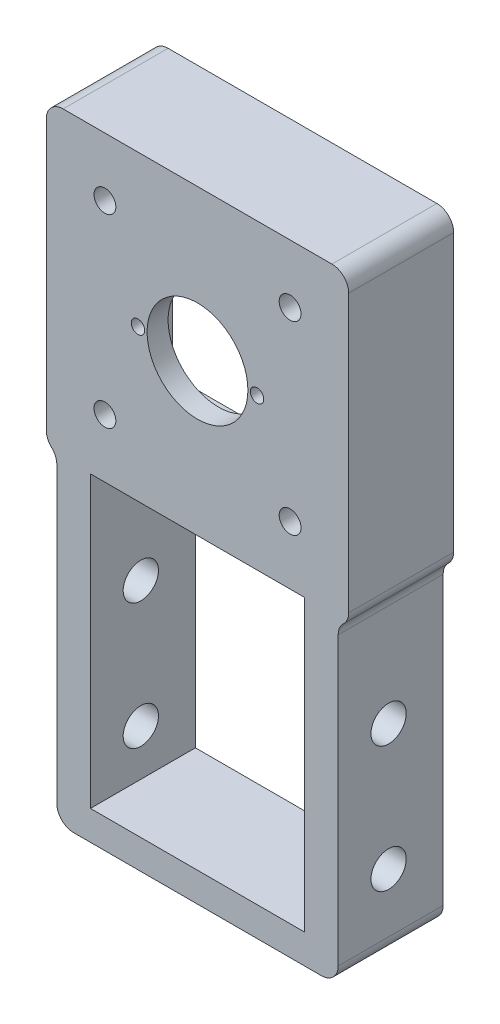
ISO-10303-21;
HEADER;
FILE_DESCRIPTION(('STEP AP214'),'2;1');
FILE_NAME('part.step','',(''),(''),'','','');
FILE_SCHEMA(('AUTOMOTIVE_DESIGN { 1 0 10303 214 1 1 1 1 }'));
ENDSEC;
DATA;
#1=APPLICATION_CONTEXT('core data for automotive mechanical design processes');
#2=APPLICATION_PROTOCOL_DEFINITION('international standard','automotive_design',2000,#1);
#3=PRODUCT_CONTEXT('',#1,'mechanical');
#4=PRODUCT('Part','Part','',(#3));
#5=PRODUCT_RELATED_PRODUCT_CATEGORY('part','',(#4));
#6=PRODUCT_DEFINITION_FORMATION('','',#4);
#7=PRODUCT_DEFINITION_CONTEXT('part definition',#1,'design');
#8=PRODUCT_DEFINITION('design','',#6,#7);
#9=PRODUCT_DEFINITION_SHAPE('','',#8);
#10=(LENGTH_UNIT() NAMED_UNIT(*) SI_UNIT(.MILLI.,.METRE.));
#11=(NAMED_UNIT(*) PLANE_ANGLE_UNIT() SI_UNIT($,.RADIAN.));
#12=(NAMED_UNIT(*) SI_UNIT($,.STERADIAN.) SOLID_ANGLE_UNIT());
#13=UNCERTAINTY_MEASURE_WITH_UNIT(LENGTH_MEASURE(1.E-05),#10,'distance_accuracy_value','');
#14=(GEOMETRIC_REPRESENTATION_CONTEXT(3) GLOBAL_UNCERTAINTY_ASSIGNED_CONTEXT((#13)) GLOBAL_UNIT_ASSIGNED_CONTEXT((#10,
#11,#12)) REPRESENTATION_CONTEXT('',''));
#15=CARTESIAN_POINT('',(0.,0.,0.));
#16=DIRECTION('',(0.,0.,1.));
#17=DIRECTION('',(1.,0.,0.));
#18=AXIS2_PLACEMENT_3D('',#15,#16,#17);
#19=CARTESIAN_POINT('',(3.175,-3.175,3.175));
#20=DIRECTION('',(0.,-1.,0.));
#21=DIRECTION('',(1.,0.,0.));
#22=AXIS2_PLACEMENT_3D('',#19,#20,#21);
#23=PLANE('',#22);
#24=DIRECTION('',(-1.,0.,0.));
#25=VECTOR('',#24,1.);
#26=CARTESIAN_POINT('',(3.175,-3.175,-12.7));
#27=LINE('',#26,#25);
#28=CARTESIAN_POINT('',(-3.4925,-3.175,-12.7));
#29=VERTEX_POINT('',#28);
#30=CARTESIAN_POINT('',(-35.8775,-3.175,-12.7));
#31=VERTEX_POINT('',#30);
#32=EDGE_CURVE('E273',#29,#31,#27,.T.);
#33=ORIENTED_EDGE('',*,*,#32,.F.);
#34=DIRECTION('',(0.,0.,-1.));
#35=VECTOR('',#34,1.);
#36=CARTESIAN_POINT('',(-3.4925,-3.175,3.175));
#37=LINE('',#36,#35);
#38=CARTESIAN_POINT('',(-3.4925,-3.175,3.175));
#39=VERTEX_POINT('',#38);
#40=EDGE_CURVE('E217',#39,#29,#37,.T.);
#41=ORIENTED_EDGE('',*,*,#40,.F.);
#42=DIRECTION('',(-1.,0.,0.));
#43=VECTOR('',#42,1.);
#44=CARTESIAN_POINT('',(3.175,-3.175,3.175));
#45=LINE('',#44,#43);
#46=CARTESIAN_POINT('',(-35.8775,-3.175,3.175));
#47=VERTEX_POINT('',#46);
#48=EDGE_CURVE('E215',#39,#47,#45,.T.);
#49=ORIENTED_EDGE('',*,*,#48,.T.);
#50=DIRECTION('',(0.,0.,-1.));
#51=VECTOR('',#50,1.);
#52=CARTESIAN_POINT('',(-35.8775,-3.175,3.175));
#53=LINE('',#52,#51);
#54=EDGE_CURVE('E222',#47,#31,#53,.T.);
#55=ORIENTED_EDGE('',*,*,#54,.T.);
#56=EDGE_LOOP('',(#33,#41,#49,#55));
#57=FACE_BOUND('',#56,.T.);
#58=ADVANCED_FACE('F41',(#57),#23,.T.);
#59=CARTESIAN_POINT('',(-28.68549,19.685,3.175));
#60=DIRECTION('',(0.,0.,-1.));
#61=DIRECTION('',(-1.,0.,0.));
#62=AXIS2_PLACEMENT_3D('',#59,#60,#61);
#63=CYLINDRICAL_SURFACE('',#62,1.016);
#64=CARTESIAN_POINT('',(-28.68549,19.685,3.175));
#65=DIRECTION('',(0.,0.,1.));
#66=DIRECTION('',(1.,0.,0.));
#67=AXIS2_PLACEMENT_3D('',#64,#65,#66);
#68=CIRCLE('',#67,1.016);
#69=CARTESIAN_POINT('',(-27.66949,19.685,3.175));
#70=VERTEX_POINT('',#69);
#71=EDGE_CURVE('E333',#70,#70,#68,.T.);
#72=ORIENTED_EDGE('',*,*,#71,.T.);
#73=EDGE_LOOP('',(#72));
#74=FACE_BOUND('',#73,.T.);
#75=CARTESIAN_POINT('',(-28.68549,19.685,0.));
#76=DIRECTION('',(0.,0.,1.));
#77=DIRECTION('',(1.,0.,0.));
#78=AXIS2_PLACEMENT_3D('',#75,#76,#77);
#79=CIRCLE('',#78,1.016);
#80=CARTESIAN_POINT('',(-27.66949,19.685,0.));
#81=VERTEX_POINT('',#80);
#82=EDGE_CURVE('E377',#81,#81,#79,.T.);
#83=ORIENTED_EDGE('',*,*,#82,.F.);
#84=EDGE_LOOP('',(#83));
#85=FACE_BOUND('',#84,.T.);
#86=ADVANCED_FACE('F564',(#74,#85),#63,.F.);
#87=CARTESIAN_POINT('',(-19.685,19.685,3.175));
#88=DIRECTION('',(0.,0.,-1.));
#89=DIRECTION('',(-1.,0.,0.));
#90=AXIS2_PLACEMENT_3D('',#87,#88,#89);
#91=CYLINDRICAL_SURFACE('',#90,7.62);
#92=CARTESIAN_POINT('',(-19.685,19.685,3.175));
#93=DIRECTION('',(0.,0.,1.));
#94=DIRECTION('',(1.,0.,0.));
#95=AXIS2_PLACEMENT_3D('',#92,#93,#94);
#96=CIRCLE('',#95,7.62);
#97=CARTESIAN_POINT('',(-12.065,19.685,3.175));
#98=VERTEX_POINT('',#97);
#99=EDGE_CURVE('E329',#98,#98,#96,.T.);
#100=ORIENTED_EDGE('',*,*,#99,.T.);
#101=EDGE_LOOP('',(#100));
#102=FACE_BOUND('',#101,.T.);
#103=CARTESIAN_POINT('',(-19.685,19.685,0.));
#104=DIRECTION('',(0.,0.,1.));
#105=DIRECTION('',(1.,0.,0.));
#106=AXIS2_PLACEMENT_3D('',#103,#104,#105);
#107=CIRCLE('',#106,7.62);
#108=CARTESIAN_POINT('',(-12.065,19.685,0.));
#109=VERTEX_POINT('',#108);
#110=EDGE_CURVE('E373',#109,#109,#107,.T.);
#111=ORIENTED_EDGE('',*,*,#110,.F.);
#112=EDGE_LOOP('',(#111));
#113=FACE_BOUND('',#112,.T.);
#114=ADVANCED_FACE('F570',(#102,#113),#91,.F.);
#115=CARTESIAN_POINT('',(-5.68452,33.68548,3.175));
#116=DIRECTION('',(0.,0.,-1.));
#117=DIRECTION('',(-1.,0.,0.));
#118=AXIS2_PLACEMENT_3D('',#115,#116,#117);
#119=CYLINDRICAL_SURFACE('',#118,1.651);
#120=CARTESIAN_POINT('',(-5.68452,33.68548,3.175));
#121=DIRECTION('',(0.,0.,1.));
#122=DIRECTION('',(1.,0.,0.));
#123=AXIS2_PLACEMENT_3D('',#120,#121,#122);
#124=CIRCLE('',#123,1.651);
#125=CARTESIAN_POINT('',(-4.03352,33.68548,3.175));
#126=VERTEX_POINT('',#125);
#127=EDGE_CURVE('E325',#126,#126,#124,.T.);
#128=ORIENTED_EDGE('',*,*,#127,.T.);
#129=EDGE_LOOP('',(#128));
#130=FACE_BOUND('',#129,.T.);
#131=CARTESIAN_POINT('',(-5.68452,33.68548,0.));
#132=DIRECTION('',(0.,0.,1.));
#133=DIRECTION('',(1.,0.,0.));
#134=AXIS2_PLACEMENT_3D('',#131,#132,#133);
#135=CIRCLE('',#134,1.651);
#136=CARTESIAN_POINT('',(-4.03352,33.68548,0.));
#137=VERTEX_POINT('',#136);
#138=EDGE_CURVE('E369',#137,#137,#135,.T.);
#139=ORIENTED_EDGE('',*,*,#138,.F.);
#140=EDGE_LOOP('',(#139));
#141=FACE_BOUND('',#140,.T.);
#142=ADVANCED_FACE('F598',(#130,#141),#119,.F.);
#143=CARTESIAN_POINT('',(-33.68548,33.68548,3.175));
#144=DIRECTION('',(0.,0.,-1.));
#145=DIRECTION('',(-1.,0.,0.));
#146=AXIS2_PLACEMENT_3D('',#143,#144,#145);
#147=CYLINDRICAL_SURFACE('',#146,1.651);
#148=CARTESIAN_POINT('',(-33.68548,33.68548,3.175));
#149=DIRECTION('',(0.,0.,1.));
#150=DIRECTION('',(1.,0.,0.));
#151=AXIS2_PLACEMENT_3D('',#148,#149,#150);
#152=CIRCLE('',#151,1.651);
#153=CARTESIAN_POINT('',(-32.03448,33.68548,3.175));
#154=VERTEX_POINT('',#153);
#155=EDGE_CURVE('E321',#154,#154,#152,.F.);
#156=ORIENTED_EDGE('',*,*,#155,.F.);
#157=EDGE_LOOP('',(#156));
#158=FACE_BOUND('',#157,.T.);
#159=CARTESIAN_POINT('',(-33.68548,33.68548,0.));
#160=DIRECTION('',(0.,0.,1.));
#161=DIRECTION('',(1.,0.,0.));
#162=AXIS2_PLACEMENT_3D('',#159,#160,#161);
#163=CIRCLE('',#162,1.651);
#164=CARTESIAN_POINT('',(-32.03448,33.68548,0.));
#165=VERTEX_POINT('',#164);
#166=EDGE_CURVE('E365',#165,#165,#163,.F.);
#167=ORIENTED_EDGE('',*,*,#166,.T.);
#168=EDGE_LOOP('',(#167));
#169=FACE_BOUND('',#168,.T.);
#170=ADVANCED_FACE('F602',(#158,#169),#147,.F.);
#171=CARTESIAN_POINT('',(-5.68452,5.68451999999999,3.175));
#172=DIRECTION('',(0.,0.,-1.));
#173=DIRECTION('',(-1.,0.,0.));
#174=AXIS2_PLACEMENT_3D('',#171,#172,#173);
#175=CYLINDRICAL_SURFACE('',#174,1.651);
#176=CARTESIAN_POINT('',(-5.68452,5.68451999999999,3.175));
#177=DIRECTION('',(0.,0.,1.));
#178=DIRECTION('',(1.,0.,0.));
#179=AXIS2_PLACEMENT_3D('',#176,#177,#178);
#180=CIRCLE('',#179,1.651);
#181=CARTESIAN_POINT('',(-4.03352,5.68451999999999,3.175));
#182=VERTEX_POINT('',#181);
#183=EDGE_CURVE('E316',#182,#182,#180,.F.);
#184=ORIENTED_EDGE('',*,*,#183,.F.);
#185=EDGE_LOOP('',(#184));
#186=FACE_BOUND('',#185,.T.);
#187=CARTESIAN_POINT('',(-5.68452,5.68451999999999,0.));
#188=DIRECTION('',(0.,0.,1.));
#189=DIRECTION('',(1.,0.,0.));
#190=AXIS2_PLACEMENT_3D('',#187,#188,#189);
#191=CIRCLE('',#190,1.651);
#192=CARTESIAN_POINT('',(-4.03352,5.68451999999999,0.));
#193=VERTEX_POINT('',#192);
#194=EDGE_CURVE('E345',#193,#193,#191,.F.);
#195=ORIENTED_EDGE('',*,*,#194,.T.);
#196=EDGE_LOOP('',(#195));
#197=FACE_BOUND('',#196,.T.);
#198=ADVANCED_FACE('F606',(#186,#197),#175,.F.);
#199=CARTESIAN_POINT('',(-33.68548,5.68451999999999,3.175));
#200=DIRECTION('',(0.,0.,-1.));
#201=DIRECTION('',(-1.,0.,0.));
#202=AXIS2_PLACEMENT_3D('',#199,#200,#201);
#203=CYLINDRICAL_SURFACE('',#202,1.651);
#204=CARTESIAN_POINT('',(-33.68548,5.68451999999999,3.175));
#205=DIRECTION('',(0.,0.,1.));
#206=DIRECTION('',(1.,0.,0.));
#207=AXIS2_PLACEMENT_3D('',#204,#205,#206);
#208=CIRCLE('',#207,1.651);
#209=CARTESIAN_POINT('',(-32.03448,5.68451999999999,3.175));
#210=VERTEX_POINT('',#209);
#211=EDGE_CURVE('E312',#210,#210,#208,.T.);
#212=ORIENTED_EDGE('',*,*,#211,.T.);
#213=EDGE_LOOP('',(#212));
#214=FACE_BOUND('',#213,.T.);
#215=CARTESIAN_POINT('',(-33.68548,5.68451999999999,0.));
#216=DIRECTION('',(0.,0.,1.));
#217=DIRECTION('',(1.,0.,0.));
#218=AXIS2_PLACEMENT_3D('',#215,#216,#217);
#219=CIRCLE('',#218,1.651);
#220=CARTESIAN_POINT('',(-32.03448,5.68451999999999,0.));
#221=VERTEX_POINT('',#220);
#222=EDGE_CURVE('E311',#221,#221,#219,.T.);
#223=ORIENTED_EDGE('',*,*,#222,.F.);
#224=EDGE_LOOP('',(#223));
#225=FACE_BOUND('',#224,.T.);
#226=ADVANCED_FACE('F593',(#214,#225),#203,.F.);
#227=CARTESIAN_POINT('',(-10.68451,19.685,3.175));
#228=DIRECTION('',(0.,0.,-1.));
#229=DIRECTION('',(-1.,0.,0.));
#230=AXIS2_PLACEMENT_3D('',#227,#228,#229);
#231=CYLINDRICAL_SURFACE('',#230,1.016);
#232=CARTESIAN_POINT('',(-10.68451,19.685,3.175));
#233=DIRECTION('',(0.,0.,1.));
#234=DIRECTION('',(1.,0.,0.));
#235=AXIS2_PLACEMENT_3D('',#232,#233,#234);
#236=CIRCLE('',#235,1.016);
#237=CARTESIAN_POINT('',(-9.66851,19.685,3.175));
#238=VERTEX_POINT('',#237);
#239=EDGE_CURVE('E337',#238,#238,#236,.F.);
#240=ORIENTED_EDGE('',*,*,#239,.F.);
#241=EDGE_LOOP('',(#240));
#242=FACE_BOUND('',#241,.T.);
#243=CARTESIAN_POINT('',(-10.68451,19.685,0.));
#244=DIRECTION('',(0.,0.,1.));
#245=DIRECTION('',(1.,0.,0.));
#246=AXIS2_PLACEMENT_3D('',#243,#244,#245);
#247=CIRCLE('',#246,1.016);
#248=CARTESIAN_POINT('',(-9.66851,19.685,0.));
#249=VERTEX_POINT('',#248);
#250=EDGE_CURVE('E317',#249,#249,#247,.F.);
#251=ORIENTED_EDGE('',*,*,#250,.T.);
#252=EDGE_LOOP('',(#251));
#253=FACE_BOUND('',#252,.T.);
#254=ADVANCED_FACE('F587',(#242,#253),#231,.F.);
#255=CARTESIAN_POINT('',(0.,0.,3.175));
#256=DIRECTION('',(0.,0.,1.));
#257=DIRECTION('',(1.,0.,0.));
#258=AXIS2_PLACEMENT_3D('',#255,#256,#257);
#259=PLANE('',#258);
#260=DIRECTION('',(0.,1.,0.));
#261=VECTOR('',#260,1.);
#262=CARTESIAN_POINT('',(-3.49250000000001,-51.435,3.175));
#263=LINE('',#262,#261);
#264=CARTESIAN_POINT('',(-3.49250000000001,-46.99,3.175));
#265=VERTEX_POINT('',#264);
#266=EDGE_CURVE('E206',#265,#39,#263,.T.);
#267=ORIENTED_EDGE('',*,*,#266,.F.);
#268=DIRECTION('',(1.,0.,0.));
#269=VECTOR('',#268,1.);
#270=CARTESIAN_POINT('',(0.,-46.99,3.175));
#271=LINE('',#270,#269);
#272=CARTESIAN_POINT('',(-35.8775,-46.99,3.175));
#273=VERTEX_POINT('',#272);
#274=EDGE_CURVE('E190',#273,#265,#271,.T.);
#275=ORIENTED_EDGE('',*,*,#274,.F.);
#276=DIRECTION('',(0.,1.,0.));
#277=VECTOR('',#276,1.);
#278=CARTESIAN_POINT('',(-35.8775,-51.435,3.175));
#279=LINE('',#278,#277);
#280=EDGE_CURVE('E237',#273,#47,#279,.T.);
#281=ORIENTED_EDGE('',*,*,#280,.T.);
#282=ORIENTED_EDGE('',*,*,#48,.F.);
#283=EDGE_LOOP('',(#267,#275,#281,#282));
#284=FACE_BOUND('',#283,.T.);
#285=DIRECTION('',(0.,-1.,0.));
#286=VECTOR('',#285,1.);
#287=CARTESIAN_POINT('',(3.175,42.545,3.175));
#288=LINE('',#287,#286);
#289=CARTESIAN_POINT('',(3.175,40.005,3.175));
#290=VERTEX_POINT('',#289);
#291=CARTESIAN_POINT('',(3.175,-1.84062638239031,3.175));
#292=VERTEX_POINT('',#291);
#293=EDGE_CURVE('E289',#290,#292,#288,.T.);
#294=ORIENTED_EDGE('',*,*,#293,.F.);
#295=CARTESIAN_POINT('',(0.634999999999997,40.005,3.175));
#296=DIRECTION('',(0.,0.,1.));
#297=DIRECTION('',(1.,0.,0.));
#298=AXIS2_PLACEMENT_3D('',#295,#296,#297);
#299=CIRCLE('',#298,2.54);
#300=CARTESIAN_POINT('',(0.634999999999997,42.545,3.175));
#301=VERTEX_POINT('',#300);
#302=EDGE_CURVE('E465',#290,#301,#299,.T.);
#303=ORIENTED_EDGE('',*,*,#302,.T.);
#304=DIRECTION('',(1.,0.,0.));
#305=VECTOR('',#304,1.);
#306=CARTESIAN_POINT('',(-42.545,42.545,3.175));
#307=LINE('',#306,#305);
#308=CARTESIAN_POINT('',(-40.005,42.545,3.175));
#309=VERTEX_POINT('',#308);
#310=EDGE_CURVE('E307',#309,#301,#307,.T.);
#311=ORIENTED_EDGE('',*,*,#310,.F.);
#312=CARTESIAN_POINT('',(-40.005,40.005,3.175));
#313=DIRECTION('',(0.,0.,1.));
#314=DIRECTION('',(1.,0.,0.));
#315=AXIS2_PLACEMENT_3D('',#312,#313,#314);
#316=CIRCLE('',#315,2.54);
#317=CARTESIAN_POINT('',(-42.545,40.005,3.175));
#318=VERTEX_POINT('',#317);
#319=EDGE_CURVE('E462',#309,#318,#316,.T.);
#320=ORIENTED_EDGE('',*,*,#319,.T.);
#321=DIRECTION('',(0.,1.,0.));
#322=VECTOR('',#321,1.);
#323=CARTESIAN_POINT('',(-42.545,-3.175,3.175));
#324=LINE('',#323,#322);
#325=CARTESIAN_POINT('',(-42.545,-0.820356980347125,3.175));
#326=VERTEX_POINT('',#325);
#327=EDGE_CURVE('E303',#326,#318,#324,.T.);
#328=ORIENTED_EDGE('',*,*,#327,.F.);
#329=CARTESIAN_POINT('',(-40.005,-0.820356980347125,3.175));
#330=DIRECTION('',(0.,0.,1.));
#331=DIRECTION('',(1.,0.,0.));
#332=AXIS2_PLACEMENT_3D('',#329,#330,#331);
#333=CIRCLE('',#332,2.54);
#334=CARTESIAN_POINT('',(-41.75125,-2.6648652989784,3.175));
#335=VERTEX_POINT('',#334);
#336=EDGE_CURVE('E456',#326,#335,#333,.T.);
#337=ORIENTED_EDGE('',*,*,#336,.T.);
#338=CARTESIAN_POINT('',(-43.4975,-4.50937361760969,3.175));
#339=DIRECTION('',(0.,0.,1.));
#340=DIRECTION('',(1.,0.,0.));
#341=AXIS2_PLACEMENT_3D('',#338,#339,#340);
#342=CIRCLE('',#341,2.54);
#343=CARTESIAN_POINT('',(-40.9575,-4.5093736176097,3.175));
#344=VERTEX_POINT('',#343);
#345=EDGE_CURVE('E11',#335,#344,#342,.F.);
#346=ORIENTED_EDGE('',*,*,#345,.T.);
#347=DIRECTION('',(0.,1.,0.));
#348=VECTOR('',#347,1.);
#349=CARTESIAN_POINT('',(-40.9575,-51.435,3.175));
#350=LINE('',#349,#348);
#351=CARTESIAN_POINT('',(-40.9575,-48.895,3.175));
#352=VERTEX_POINT('',#351);
#353=EDGE_CURVE('E249',#352,#344,#350,.T.);
#354=ORIENTED_EDGE('',*,*,#353,.F.);
#355=CARTESIAN_POINT('',(-38.4175,-48.895,3.175));
#356=DIRECTION('',(0.,0.,1.));
#357=DIRECTION('',(1.,0.,0.));
#358=AXIS2_PLACEMENT_3D('',#355,#356,#357);
#359=CIRCLE('',#358,2.54);
#360=CARTESIAN_POINT('',(-38.4175,-51.435,3.175));
#361=VERTEX_POINT('',#360);
#362=EDGE_CURVE('E414',#352,#361,#359,.T.);
#363=ORIENTED_EDGE('',*,*,#362,.T.);
#364=DIRECTION('',(-1.,0.,0.));
#365=VECTOR('',#364,1.);
#366=CARTESIAN_POINT('',(-35.8775,-51.435,3.175));
#367=LINE('',#366,#365);
#368=CARTESIAN_POINT('',(-0.952500000000009,-51.435,3.175));
#369=VERTEX_POINT('',#368);
#370=EDGE_CURVE('E229',#369,#361,#367,.T.);
#371=ORIENTED_EDGE('',*,*,#370,.F.);
#372=CARTESIAN_POINT('',(-0.952500000000005,-48.895,3.175));
#373=DIRECTION('',(0.,0.,1.));
#374=DIRECTION('',(1.,0.,0.));
#375=AXIS2_PLACEMENT_3D('',#372,#373,#374);
#376=CIRCLE('',#375,2.54);
#377=CARTESIAN_POINT('',(1.5875,-48.895,3.175));
#378=VERTEX_POINT('',#377);
#379=EDGE_CURVE('E417',#369,#378,#376,.T.);
#380=ORIENTED_EDGE('',*,*,#379,.T.);
#381=DIRECTION('',(0.,1.,0.));
#382=VECTOR('',#381,1.);
#383=CARTESIAN_POINT('',(1.58749999999999,-51.435,3.175));
#384=LINE('',#383,#382);
#385=CARTESIAN_POINT('',(1.5875,-5.52964301965289,3.175));
#386=VERTEX_POINT('',#385);
#387=EDGE_CURVE('E218',#378,#386,#384,.T.);
#388=ORIENTED_EDGE('',*,*,#387,.T.);
#389=CARTESIAN_POINT('',(4.1275,-5.52964301965287,3.175));
#390=DIRECTION('',(0.,0.,1.));
#391=DIRECTION('',(1.,0.,0.));
#392=AXIS2_PLACEMENT_3D('',#389,#390,#391);
#393=CIRCLE('',#392,2.54);
#394=CARTESIAN_POINT('',(2.38125,-3.68513470102159,3.175));
#395=VERTEX_POINT('',#394);
#396=EDGE_CURVE('E426',#386,#395,#393,.F.);
#397=ORIENTED_EDGE('',*,*,#396,.T.);
#398=CARTESIAN_POINT('',(0.634999999999995,-1.84062638239031,3.175));
#399=DIRECTION('',(0.,0.,1.));
#400=DIRECTION('',(1.,0.,0.));
#401=AXIS2_PLACEMENT_3D('',#398,#399,#400);
#402=CIRCLE('',#401,2.54);
#403=EDGE_CURVE('E459',#395,#292,#402,.T.);
#404=ORIENTED_EDGE('',*,*,#403,.T.);
#405=EDGE_LOOP('',(#294,#303,#311,#320,#328,#337,#346,#354,#363,#371,#380,#388,#397,#404));
#406=FACE_BOUND('',#405,.T.);
#407=ORIENTED_EDGE('',*,*,#211,.F.);
#408=EDGE_LOOP('',(#407));
#409=FACE_BOUND('',#408,.T.);
#410=ORIENTED_EDGE('',*,*,#183,.T.);
#411=EDGE_LOOP('',(#410));
#412=FACE_BOUND('',#411,.T.);
#413=ORIENTED_EDGE('',*,*,#155,.T.);
#414=EDGE_LOOP('',(#413));
#415=FACE_BOUND('',#414,.T.);
#416=ORIENTED_EDGE('',*,*,#127,.F.);
#417=EDGE_LOOP('',(#416));
#418=FACE_BOUND('',#417,.T.);
#419=ORIENTED_EDGE('',*,*,#99,.F.);
#420=EDGE_LOOP('',(#419));
#421=FACE_BOUND('',#420,.T.);
#422=ORIENTED_EDGE('',*,*,#71,.F.);
#423=EDGE_LOOP('',(#422));
#424=FACE_BOUND('',#423,.T.);
#425=ORIENTED_EDGE('',*,*,#239,.T.);
#426=EDGE_LOOP('',(#425));
#427=FACE_BOUND('',#426,.T.);
#428=ADVANCED_FACE('F212',(#284,#406,#409,#412,#415,#418,#421,#424,#427),#259,.T.);
#429=CARTESIAN_POINT('',(0.,0.,0.));
#430=DIRECTION('',(0.,0.,1.));
#431=DIRECTION('',(1.,0.,0.));
#432=AXIS2_PLACEMENT_3D('',#429,#430,#431);
#433=PLANE('',#432);
#434=ORIENTED_EDGE('',*,*,#222,.T.);
#435=EDGE_LOOP('',(#434));
#436=FACE_BOUND('',#435,.T.);
#437=ORIENTED_EDGE('',*,*,#194,.F.);
#438=EDGE_LOOP('',(#437));
#439=FACE_BOUND('',#438,.T.);
#440=DIRECTION('',(0.,1.,0.));
#441=VECTOR('',#440,1.);
#442=CARTESIAN_POINT('',(-39.37,0.,0.));
#443=LINE('',#442,#441);
#444=CARTESIAN_POINT('',(-39.37,0.,0.));
#445=VERTEX_POINT('',#444);
#446=CARTESIAN_POINT('',(-39.37,39.37,0.));
#447=VERTEX_POINT('',#446);
#448=EDGE_CURVE('E349',#445,#447,#443,.T.);
#449=ORIENTED_EDGE('',*,*,#448,.T.);
#450=DIRECTION('',(1.,0.,0.));
#451=VECTOR('',#450,1.);
#452=CARTESIAN_POINT('',(0.,39.37,0.));
#453=LINE('',#452,#451);
#454=CARTESIAN_POINT('',(0.,39.37,0.));
#455=VERTEX_POINT('',#454);
#456=EDGE_CURVE('E361',#447,#455,#453,.T.);
#457=ORIENTED_EDGE('',*,*,#456,.T.);
#458=DIRECTION('',(0.,-1.,0.));
#459=VECTOR('',#458,1.);
#460=CARTESIAN_POINT('',(0.,0.,0.));
#461=LINE('',#460,#459);
#462=CARTESIAN_POINT('',(0.,0.,0.));
#463=VERTEX_POINT('',#462);
#464=EDGE_CURVE('E357',#455,#463,#461,.T.);
#465=ORIENTED_EDGE('',*,*,#464,.T.);
#466=DIRECTION('',(-1.,0.,0.));
#467=VECTOR('',#466,1.);
#468=CARTESIAN_POINT('',(0.,0.,0.));
#469=LINE('',#468,#467);
#470=EDGE_CURVE('E353',#463,#445,#469,.T.);
#471=ORIENTED_EDGE('',*,*,#470,.T.);
#472=EDGE_LOOP('',(#449,#457,#465,#471));
#473=FACE_BOUND('',#472,.T.);
#474=ORIENTED_EDGE('',*,*,#166,.F.);
#475=EDGE_LOOP('',(#474));
#476=FACE_BOUND('',#475,.T.);
#477=ORIENTED_EDGE('',*,*,#138,.T.);
#478=EDGE_LOOP('',(#477));
#479=FACE_BOUND('',#478,.T.);
#480=ORIENTED_EDGE('',*,*,#110,.T.);
#481=EDGE_LOOP('',(#480));
#482=FACE_BOUND('',#481,.T.);
#483=ORIENTED_EDGE('',*,*,#82,.T.);
#484=EDGE_LOOP('',(#483));
#485=FACE_BOUND('',#484,.T.);
#486=ORIENTED_EDGE('',*,*,#250,.F.);
#487=EDGE_LOOP('',(#486));
#488=FACE_BOUND('',#487,.T.);
#489=ADVANCED_FACE('F586',(#436,#439,#473,#476,#479,#482,#485,#488),#433,.F.);
#490=CARTESIAN_POINT('',(0.,39.37,3.175));
#491=DIRECTION('',(1.,0.,0.));
#492=DIRECTION('',(0.,0.,-1.));
#493=AXIS2_PLACEMENT_3D('',#490,#491,#492);
#494=PLANE('',#493);
#495=DIRECTION('',(0.,0.,-1.));
#496=VECTOR('',#495,1.);
#497=CARTESIAN_POINT('',(0.,0.,3.175));
#498=LINE('',#497,#496);
#499=CARTESIAN_POINT('',(0.,0.,-12.7));
#500=VERTEX_POINT('',#499);
#501=EDGE_CURVE('E285',#463,#500,#498,.T.);
#502=ORIENTED_EDGE('',*,*,#501,.F.);
#503=ORIENTED_EDGE('',*,*,#464,.F.);
#504=DIRECTION('',(0.,0.,-1.));
#505=VECTOR('',#504,1.);
#506=CARTESIAN_POINT('',(0.,39.37,3.175));
#507=LINE('',#506,#505);
#508=CARTESIAN_POINT('',(0.,39.37,-12.7));
#509=VERTEX_POINT('',#508);
#510=EDGE_CURVE('E286',#455,#509,#507,.T.);
#511=ORIENTED_EDGE('',*,*,#510,.T.);
#512=DIRECTION('',(0.,-1.,0.));
#513=VECTOR('',#512,1.);
#514=CARTESIAN_POINT('',(0.,39.37,-12.7));
#515=LINE('',#514,#513);
#516=EDGE_CURVE('E253',#509,#500,#515,.T.);
#517=ORIENTED_EDGE('',*,*,#516,.T.);
#518=EDGE_LOOP('',(#502,#503,#511,#517));
#519=FACE_BOUND('',#518,.T.);
#520=ADVANCED_FACE('F590',(#519),#494,.F.);
#521=CARTESIAN_POINT('',(-39.37,39.37,3.175));
#522=DIRECTION('',(0.,1.,0.));
#523=DIRECTION('',(0.,0.,1.));
#524=AXIS2_PLACEMENT_3D('',#521,#522,#523);
#525=PLANE('',#524);
#526=ORIENTED_EDGE('',*,*,#510,.F.);
#527=ORIENTED_EDGE('',*,*,#456,.F.);
#528=DIRECTION('',(0.,0.,-1.));
#529=VECTOR('',#528,1.);
#530=CARTESIAN_POINT('',(-39.37,39.37,3.175));
#531=LINE('',#530,#529);
#532=CARTESIAN_POINT('',(-39.37,39.37,-12.7));
#533=VERTEX_POINT('',#532);
#534=EDGE_CURVE('E290',#447,#533,#531,.T.);
#535=ORIENTED_EDGE('',*,*,#534,.T.);
#536=DIRECTION('',(1.,0.,0.));
#537=VECTOR('',#536,1.);
#538=CARTESIAN_POINT('',(-39.37,39.37,-12.7));
#539=LINE('',#538,#537);
#540=EDGE_CURVE('E265',#533,#509,#539,.T.);
#541=ORIENTED_EDGE('',*,*,#540,.T.);
#542=EDGE_LOOP('',(#526,#527,#535,#541));
#543=FACE_BOUND('',#542,.T.);
#544=ADVANCED_FACE('F663',(#543),#525,.F.);
#545=CARTESIAN_POINT('',(-39.37,0.,3.175));
#546=DIRECTION('',(-1.,0.,0.));
#547=DIRECTION('',(0.,0.,1.));
#548=AXIS2_PLACEMENT_3D('',#545,#546,#547);
#549=PLANE('',#548);
#550=ORIENTED_EDGE('',*,*,#534,.F.);
#551=ORIENTED_EDGE('',*,*,#448,.F.);
#552=DIRECTION('',(0.,0.,-1.));
#553=VECTOR('',#552,1.);
#554=CARTESIAN_POINT('',(-39.37,0.,3.175));
#555=LINE('',#554,#553);
#556=CARTESIAN_POINT('',(-39.37,0.,-12.7));
#557=VERTEX_POINT('',#556);
#558=EDGE_CURVE('E293',#445,#557,#555,.T.);
#559=ORIENTED_EDGE('',*,*,#558,.T.);
#560=DIRECTION('',(0.,1.,0.));
#561=VECTOR('',#560,1.);
#562=CARTESIAN_POINT('',(-39.37,0.,-12.7));
#563=LINE('',#562,#561);
#564=EDGE_CURVE('E261',#557,#533,#563,.T.);
#565=ORIENTED_EDGE('',*,*,#564,.T.);
#566=EDGE_LOOP('',(#550,#551,#559,#565));
#567=FACE_BOUND('',#566,.T.);
#568=ADVANCED_FACE('F667',(#567),#549,.F.);
#569=CARTESIAN_POINT('',(0.,0.,3.175));
#570=DIRECTION('',(0.,-1.,0.));
#571=DIRECTION('',(0.,0.,-1.));
#572=AXIS2_PLACEMENT_3D('',#569,#570,#571);
#573=PLANE('',#572);
#574=ORIENTED_EDGE('',*,*,#558,.F.);
#575=ORIENTED_EDGE('',*,*,#470,.F.);
#576=ORIENTED_EDGE('',*,*,#501,.T.);
#577=DIRECTION('',(-1.,0.,0.));
#578=VECTOR('',#577,1.);
#579=CARTESIAN_POINT('',(0.,0.,-12.7));
#580=LINE('',#579,#578);
#581=EDGE_CURVE('E257',#500,#557,#580,.T.);
#582=ORIENTED_EDGE('',*,*,#581,.T.);
#583=EDGE_LOOP('',(#574,#575,#576,#582));
#584=FACE_BOUND('',#583,.T.);
#585=ADVANCED_FACE('F582',(#584),#573,.F.);
#586=CARTESIAN_POINT('',(3.175,42.545,3.175));
#587=DIRECTION('',(1.,0.,0.));
#588=DIRECTION('',(0.,1.,0.));
#589=AXIS2_PLACEMENT_3D('',#586,#587,#588);
#590=PLANE('',#589);
#591=DIRECTION('',(0.,-1.,0.));
#592=VECTOR('',#591,1.);
#593=CARTESIAN_POINT('',(3.175,42.545,-12.7));
#594=LINE('',#593,#592);
#595=CARTESIAN_POINT('',(3.175,40.005,-12.7));
#596=VERTEX_POINT('',#595);
#597=CARTESIAN_POINT('',(3.175,-1.84062638239031,-12.7));
#598=VERTEX_POINT('',#597);
#599=EDGE_CURVE('E269',#596,#598,#594,.T.);
#600=ORIENTED_EDGE('',*,*,#599,.F.);
#601=DIRECTION('',(0.,0.,-1.));
#602=VECTOR('',#601,1.);
#603=CARTESIAN_POINT('',(3.175,40.005,3.175));
#604=LINE('',#603,#602);
#605=EDGE_CURVE('E453',#596,#290,#604,.F.);
#606=ORIENTED_EDGE('',*,*,#605,.T.);
#607=ORIENTED_EDGE('',*,*,#293,.T.);
#608=DIRECTION('',(0.,0.,-1.));
#609=VECTOR('',#608,1.);
#610=CARTESIAN_POINT('',(3.175,-1.84062638239031,-12.7));
#611=LINE('',#610,#609);
#612=EDGE_CURVE('E449',#292,#598,#611,.T.);
#613=ORIENTED_EDGE('',*,*,#612,.T.);
#614=EDGE_LOOP('',(#600,#606,#607,#613));
#615=FACE_BOUND('',#614,.T.);
#616=ADVANCED_FACE('F578',(#615),#590,.T.);
#617=CARTESIAN_POINT('',(-42.545,42.545,3.175));
#618=DIRECTION('',(0.,1.,0.));
#619=DIRECTION('',(-1.,0.,0.));
#620=AXIS2_PLACEMENT_3D('',#617,#618,#619);
#621=PLANE('',#620);
#622=ORIENTED_EDGE('',*,*,#310,.T.);
#623=DIRECTION('',(0.,0.,-1.));
#624=VECTOR('',#623,1.);
#625=CARTESIAN_POINT('',(0.634999999999997,42.545,3.175));
#626=LINE('',#625,#624);
#627=CARTESIAN_POINT('',(0.634999999999997,42.545,-12.7));
#628=VERTEX_POINT('',#627);
#629=EDGE_CURVE('E433',#301,#628,#626,.T.);
#630=ORIENTED_EDGE('',*,*,#629,.T.);
#631=DIRECTION('',(1.,0.,0.));
#632=VECTOR('',#631,1.);
#633=CARTESIAN_POINT('',(-42.545,42.545,-12.7));
#634=LINE('',#633,#632);
#635=CARTESIAN_POINT('',(-40.005,42.545,-12.7));
#636=VERTEX_POINT('',#635);
#637=EDGE_CURVE('E281',#636,#628,#634,.T.);
#638=ORIENTED_EDGE('',*,*,#637,.F.);
#639=DIRECTION('',(0.,0.,-1.));
#640=VECTOR('',#639,1.);
#641=CARTESIAN_POINT('',(-40.005,42.545,3.175));
#642=LINE('',#641,#640);
#643=EDGE_CURVE('E430',#636,#309,#642,.F.);
#644=ORIENTED_EDGE('',*,*,#643,.T.);
#645=EDGE_LOOP('',(#622,#630,#638,#644));
#646=FACE_BOUND('',#645,.T.);
#647=ADVANCED_FACE('F581',(#646),#621,.T.);
#648=CARTESIAN_POINT('',(-42.545,-3.175,3.175));
#649=DIRECTION('',(-1.,0.,0.));
#650=DIRECTION('',(0.,0.,1.));
#651=AXIS2_PLACEMENT_3D('',#648,#649,#650);
#652=PLANE('',#651);
#653=ORIENTED_EDGE('',*,*,#327,.T.);
#654=DIRECTION('',(0.,0.,-1.));
#655=VECTOR('',#654,1.);
#656=CARTESIAN_POINT('',(-42.545,40.005,3.175));
#657=LINE('',#656,#655);
#658=CARTESIAN_POINT('',(-42.545,40.005,-12.7));
#659=VERTEX_POINT('',#658);
#660=EDGE_CURVE('E471',#318,#659,#657,.T.);
#661=ORIENTED_EDGE('',*,*,#660,.T.);
#662=DIRECTION('',(0.,1.,0.));
#663=VECTOR('',#662,1.);
#664=CARTESIAN_POINT('',(-42.545,-3.175,-12.7));
#665=LINE('',#664,#663);
#666=CARTESIAN_POINT('',(-42.545,-0.820356980347125,-12.7));
#667=VERTEX_POINT('',#666);
#668=EDGE_CURVE('E277',#667,#659,#665,.T.);
#669=ORIENTED_EDGE('',*,*,#668,.F.);
#670=DIRECTION('',(0.,0.,-1.));
#671=VECTOR('',#670,1.);
#672=CARTESIAN_POINT('',(-42.545,-0.820356980347125,3.175));
#673=LINE('',#672,#671);
#674=EDGE_CURVE('E468',#667,#326,#673,.F.);
#675=ORIENTED_EDGE('',*,*,#674,.T.);
#676=EDGE_LOOP('',(#653,#661,#669,#675));
#677=FACE_BOUND('',#676,.T.);
#678=ADVANCED_FACE('F576',(#677),#652,.T.);
#679=CARTESIAN_POINT('',(0.,0.,-12.7));
#680=DIRECTION('',(0.,0.,-1.));
#681=DIRECTION('',(-1.,0.,0.));
#682=AXIS2_PLACEMENT_3D('',#679,#680,#681);
#683=PLANE('',#682);
#684=DIRECTION('',(0.,1.,0.));
#685=VECTOR('',#684,1.);
#686=CARTESIAN_POINT('',(-35.8775,-51.435,-12.7));
#687=LINE('',#686,#685);
#688=CARTESIAN_POINT('',(-35.8775,-46.99,-12.7));
#689=VERTEX_POINT('',#688);
#690=EDGE_CURVE('E243',#689,#31,#687,.T.);
#691=ORIENTED_EDGE('',*,*,#690,.F.);
#692=DIRECTION('',(1.,0.,0.));
#693=VECTOR('',#692,1.);
#694=CARTESIAN_POINT('',(0.,-46.99,-12.7));
#695=LINE('',#694,#693);
#696=CARTESIAN_POINT('',(-3.49250000000001,-46.99,-12.7));
#697=VERTEX_POINT('',#696);
#698=EDGE_CURVE('E200',#689,#697,#695,.T.);
#699=ORIENTED_EDGE('',*,*,#698,.T.);
#700=DIRECTION('',(0.,1.,0.));
#701=VECTOR('',#700,1.);
#702=CARTESIAN_POINT('',(-3.49250000000001,-51.435,-12.7));
#703=LINE('',#702,#701);
#704=EDGE_CURVE('E208',#697,#29,#703,.T.);
#705=ORIENTED_EDGE('',*,*,#704,.T.);
#706=ORIENTED_EDGE('',*,*,#32,.T.);
#707=EDGE_LOOP('',(#691,#699,#705,#706));
#708=FACE_BOUND('',#707,.T.);
#709=ORIENTED_EDGE('',*,*,#637,.T.);
#710=CARTESIAN_POINT('',(0.634999999999997,40.005,-12.7));
#711=DIRECTION('',(0.,0.,-1.));
#712=DIRECTION('',(-1.,0.,0.));
#713=AXIS2_PLACEMENT_3D('',#710,#711,#712);
#714=CIRCLE('',#713,2.54);
#715=EDGE_CURVE('E446',#628,#596,#714,.T.);
#716=ORIENTED_EDGE('',*,*,#715,.T.);
#717=ORIENTED_EDGE('',*,*,#599,.T.);
#718=CARTESIAN_POINT('',(0.634999999999995,-1.84062638239031,-12.7));
#719=DIRECTION('',(0.,0.,-1.));
#720=DIRECTION('',(-1.,0.,0.));
#721=AXIS2_PLACEMENT_3D('',#718,#719,#720);
#722=CIRCLE('',#721,2.54);
#723=CARTESIAN_POINT('',(2.38125,-3.68513470102159,-12.7));
#724=VERTEX_POINT('',#723);
#725=EDGE_CURVE('E440',#598,#724,#722,.T.);
#726=ORIENTED_EDGE('',*,*,#725,.T.);
#727=CARTESIAN_POINT('',(4.1275,-5.52964301965287,-12.7));
#728=DIRECTION('',(0.,0.,-1.));
#729=DIRECTION('',(-1.,0.,0.));
#730=AXIS2_PLACEMENT_3D('',#727,#728,#729);
#731=CIRCLE('',#730,2.54);
#732=CARTESIAN_POINT('',(1.5875,-5.52964301965289,-12.7));
#733=VERTEX_POINT('',#732);
#734=EDGE_CURVE('E423',#724,#733,#731,.F.);
#735=ORIENTED_EDGE('',*,*,#734,.T.);
#736=DIRECTION('',(0.,1.,0.));
#737=VECTOR('',#736,1.);
#738=CARTESIAN_POINT('',(1.58749999999999,-51.435,-12.7));
#739=LINE('',#738,#737);
#740=CARTESIAN_POINT('',(1.5875,-48.895,-12.7));
#741=VERTEX_POINT('',#740);
#742=EDGE_CURVE('E225',#741,#733,#739,.T.);
#743=ORIENTED_EDGE('',*,*,#742,.F.);
#744=CARTESIAN_POINT('',(-0.952500000000005,-48.895,-12.7));
#745=DIRECTION('',(0.,0.,-1.));
#746=DIRECTION('',(-1.,0.,0.));
#747=AXIS2_PLACEMENT_3D('',#744,#745,#746);
#748=CIRCLE('',#747,2.54);
#749=CARTESIAN_POINT('',(-0.952500000000009,-51.435,-12.7));
#750=VERTEX_POINT('',#749);
#751=EDGE_CURVE('E404',#741,#750,#748,.T.);
#752=ORIENTED_EDGE('',*,*,#751,.T.);
#753=DIRECTION('',(1.,0.,0.));
#754=VECTOR('',#753,1.);
#755=CARTESIAN_POINT('',(-40.9575,-51.435,-12.7));
#756=LINE('',#755,#754);
#757=CARTESIAN_POINT('',(-38.4175,-51.435,-12.7));
#758=VERTEX_POINT('',#757);
#759=EDGE_CURVE('E233',#758,#750,#756,.T.);
#760=ORIENTED_EDGE('',*,*,#759,.F.);
#761=CARTESIAN_POINT('',(-38.4175,-48.895,-12.7));
#762=DIRECTION('',(0.,0.,-1.));
#763=DIRECTION('',(-1.,0.,0.));
#764=AXIS2_PLACEMENT_3D('',#761,#762,#763);
#765=CIRCLE('',#764,2.54);
#766=CARTESIAN_POINT('',(-40.9575,-48.895,-12.7));
#767=VERTEX_POINT('',#766);
#768=EDGE_CURVE('E401',#758,#767,#765,.T.);
#769=ORIENTED_EDGE('',*,*,#768,.T.);
#770=DIRECTION('',(0.,1.,0.));
#771=VECTOR('',#770,1.);
#772=CARTESIAN_POINT('',(-40.9575,-51.435,-12.7));
#773=LINE('',#772,#771);
#774=CARTESIAN_POINT('',(-40.9575,-4.5093736176097,-12.7));
#775=VERTEX_POINT('',#774);
#776=EDGE_CURVE('E246',#767,#775,#773,.T.);
#777=ORIENTED_EDGE('',*,*,#776,.T.);
#778=CARTESIAN_POINT('',(-43.4975,-4.50937361760969,-12.7));
#779=DIRECTION('',(0.,0.,-1.));
#780=DIRECTION('',(-1.,0.,0.));
#781=AXIS2_PLACEMENT_3D('',#778,#779,#780);
#782=CIRCLE('',#781,2.54);
#783=CARTESIAN_POINT('',(-41.75125,-2.6648652989784,-12.7));
#784=VERTEX_POINT('',#783);
#785=EDGE_CURVE('E50',#775,#784,#782,.F.);
#786=ORIENTED_EDGE('',*,*,#785,.T.);
#787=CARTESIAN_POINT('',(-40.005,-0.820356980347125,-12.7));
#788=DIRECTION('',(0.,0.,-1.));
#789=DIRECTION('',(-1.,0.,0.));
#790=AXIS2_PLACEMENT_3D('',#787,#788,#789);
#791=CIRCLE('',#790,2.54);
#792=EDGE_CURVE('E437',#784,#667,#791,.T.);
#793=ORIENTED_EDGE('',*,*,#792,.T.);
#794=ORIENTED_EDGE('',*,*,#668,.T.);
#795=CARTESIAN_POINT('',(-40.005,40.005,-12.7));
#796=DIRECTION('',(0.,0.,-1.));
#797=DIRECTION('',(-1.,0.,0.));
#798=AXIS2_PLACEMENT_3D('',#795,#796,#797);
#799=CIRCLE('',#798,2.54);
#800=EDGE_CURVE('E443',#659,#636,#799,.T.);
#801=ORIENTED_EDGE('',*,*,#800,.T.);
#802=EDGE_LOOP('',(#709,#716,#717,#726,#735,#743,#752,#760,#769,#777,#786,#793,#794,#801));
#803=FACE_BOUND('',#802,.T.);
#804=ORIENTED_EDGE('',*,*,#581,.F.);
#805=ORIENTED_EDGE('',*,*,#516,.F.);
#806=ORIENTED_EDGE('',*,*,#540,.F.);
#807=ORIENTED_EDGE('',*,*,#564,.F.);
#808=EDGE_LOOP('',(#804,#805,#806,#807));
#809=FACE_BOUND('',#808,.T.);
#810=ADVANCED_FACE('F492',(#708,#803,#809),#683,.T.);
#811=CARTESIAN_POINT('',(-40.9575,-51.435,3.175));
#812=DIRECTION('',(1.,0.,0.));
#813=DIRECTION('',(0.,1.,0.));
#814=AXIS2_PLACEMENT_3D('',#811,#812,#813);
#815=PLANE('',#814);
#816=CARTESIAN_POINT('',(-40.9575,-40.005,-4.445));
#817=DIRECTION('',(1.,0.,0.));
#818=DIRECTION('',(0.,1.,0.));
#819=AXIS2_PLACEMENT_3D('',#816,#817,#818);
#820=CIRCLE('',#819,2.667);
#821=CARTESIAN_POINT('',(-40.9575,-37.338,-4.445));
#822=VERTEX_POINT('',#821);
#823=EDGE_CURVE('E524',#822,#822,#820,.T.);
#824=ORIENTED_EDGE('',*,*,#823,.T.);
#825=EDGE_LOOP('',(#824));
#826=FACE_BOUND('',#825,.T.);
#827=CARTESIAN_POINT('',(-40.9575,-20.955,-4.445));
#828=DIRECTION('',(1.,0.,0.));
#829=DIRECTION('',(0.,1.,0.));
#830=AXIS2_PLACEMENT_3D('',#827,#828,#829);
#831=CIRCLE('',#830,2.667);
#832=CARTESIAN_POINT('',(-40.9575,-18.288,-4.445));
#833=VERTEX_POINT('',#832);
#834=EDGE_CURVE('E394',#833,#833,#831,.T.);
#835=ORIENTED_EDGE('',*,*,#834,.T.);
#836=EDGE_LOOP('',(#835));
#837=FACE_BOUND('',#836,.T.);
#838=ORIENTED_EDGE('',*,*,#353,.T.);
#839=DIRECTION('',(0.,0.,1.));
#840=VECTOR('',#839,1.);
#841=CARTESIAN_POINT('',(-40.9575,-4.50937361760969,3.175));
#842=LINE('',#841,#840);
#843=EDGE_CURVE('E478',#344,#775,#842,.F.);
#844=ORIENTED_EDGE('',*,*,#843,.T.);
#845=ORIENTED_EDGE('',*,*,#776,.F.);
#846=DIRECTION('',(0.,0.,-1.));
#847=VECTOR('',#846,1.);
#848=CARTESIAN_POINT('',(-40.9575,-48.895,3.175));
#849=LINE('',#848,#847);
#850=EDGE_CURVE('E420',#767,#352,#849,.F.);
#851=ORIENTED_EDGE('',*,*,#850,.T.);
#852=EDGE_LOOP('',(#838,#844,#845,#851));
#853=FACE_BOUND('',#852,.T.);
#854=ADVANCED_FACE('F487',(#826,#837,#853),#815,.F.);
#855=CARTESIAN_POINT('',(-35.8775,-51.435,3.175));
#856=DIRECTION('',(1.,0.,0.));
#857=DIRECTION('',(0.,1.,0.));
#858=AXIS2_PLACEMENT_3D('',#855,#856,#857);
#859=PLANE('',#858);
#860=CARTESIAN_POINT('',(-35.8775,-40.005,-4.445));
#861=DIRECTION('',(1.,0.,0.));
#862=DIRECTION('',(0.,1.,0.));
#863=AXIS2_PLACEMENT_3D('',#860,#861,#862);
#864=CIRCLE('',#863,2.667);
#865=CARTESIAN_POINT('',(-35.8775,-37.338,-4.445));
#866=VERTEX_POINT('',#865);
#867=EDGE_CURVE('E528',#866,#866,#864,.T.);
#868=ORIENTED_EDGE('',*,*,#867,.F.);
#869=EDGE_LOOP('',(#868));
#870=FACE_BOUND('',#869,.T.);
#871=CARTESIAN_POINT('',(-35.8775,-20.955,-4.445));
#872=DIRECTION('',(1.,0.,0.));
#873=DIRECTION('',(0.,1.,0.));
#874=AXIS2_PLACEMENT_3D('',#871,#872,#873);
#875=CIRCLE('',#874,2.667);
#876=CARTESIAN_POINT('',(-35.8775,-18.288,-4.445));
#877=VERTEX_POINT('',#876);
#878=EDGE_CURVE('E538',#877,#877,#875,.T.);
#879=ORIENTED_EDGE('',*,*,#878,.F.);
#880=EDGE_LOOP('',(#879));
#881=FACE_BOUND('',#880,.T.);
#882=DIRECTION('',(0.,0.,1.));
#883=VECTOR('',#882,1.);
#884=CARTESIAN_POINT('',(-35.8775,-46.99,3.175));
#885=LINE('',#884,#883);
#886=EDGE_CURVE('E196',#689,#273,#885,.T.);
#887=ORIENTED_EDGE('',*,*,#886,.F.);
#888=ORIENTED_EDGE('',*,*,#690,.T.);
#889=ORIENTED_EDGE('',*,*,#54,.F.);
#890=ORIENTED_EDGE('',*,*,#280,.F.);
#891=EDGE_LOOP('',(#887,#888,#889,#890));
#892=FACE_BOUND('',#891,.T.);
#893=ADVANCED_FACE('F680',(#870,#881,#892),#859,.T.);
#894=CARTESIAN_POINT('',(0.,-51.435,0.));
#895=DIRECTION('',(0.,-1.,0.));
#896=DIRECTION('',(1.,0.,0.));
#897=AXIS2_PLACEMENT_3D('',#894,#895,#896);
#898=PLANE('',#897);
#899=ORIENTED_EDGE('',*,*,#759,.T.);
#900=DIRECTION('',(0.,0.,-1.));
#901=VECTOR('',#900,1.);
#902=CARTESIAN_POINT('',(-0.952500000000005,-51.435,0.));
#903=LINE('',#902,#901);
#904=EDGE_CURVE('E411',#750,#369,#903,.F.);
#905=ORIENTED_EDGE('',*,*,#904,.T.);
#906=ORIENTED_EDGE('',*,*,#370,.T.);
#907=DIRECTION('',(0.,0.,-1.));
#908=VECTOR('',#907,1.);
#909=CARTESIAN_POINT('',(-38.4175,-51.435,-12.7));
#910=LINE('',#909,#908);
#911=EDGE_CURVE('E407',#361,#758,#910,.T.);
#912=ORIENTED_EDGE('',*,*,#911,.T.);
#913=EDGE_LOOP('',(#899,#905,#906,#912));
#914=FACE_BOUND('',#913,.T.);
#915=ADVANCED_FACE('F500',(#914),#898,.T.);
#916=CARTESIAN_POINT('',(-3.49250000000001,-51.435,3.175));
#917=DIRECTION('',(1.,0.,0.));
#918=DIRECTION('',(0.,1.,0.));
#919=AXIS2_PLACEMENT_3D('',#916,#917,#918);
#920=PLANE('',#919);
#921=CARTESIAN_POINT('',(-3.49250000000001,-40.005,-4.445));
#922=DIRECTION('',(1.,0.,0.));
#923=DIRECTION('',(0.,1.,0.));
#924=AXIS2_PLACEMENT_3D('',#921,#922,#923);
#925=CIRCLE('',#924,2.667);
#926=CARTESIAN_POINT('',(-3.49250000000001,-37.338,-4.445));
#927=VERTEX_POINT('',#926);
#928=EDGE_CURVE('E393',#927,#927,#925,.T.);
#929=ORIENTED_EDGE('',*,*,#928,.T.);
#930=EDGE_LOOP('',(#929));
#931=FACE_BOUND('',#930,.T.);
#932=CARTESIAN_POINT('',(-3.4925,-20.955,-4.445));
#933=DIRECTION('',(1.,0.,0.));
#934=DIRECTION('',(0.,1.,0.));
#935=AXIS2_PLACEMENT_3D('',#932,#933,#934);
#936=CIRCLE('',#935,2.667);
#937=CARTESIAN_POINT('',(-3.4925,-18.288,-4.445));
#938=VERTEX_POINT('',#937);
#939=EDGE_CURVE('E388',#938,#938,#936,.T.);
#940=ORIENTED_EDGE('',*,*,#939,.T.);
#941=EDGE_LOOP('',(#940));
#942=FACE_BOUND('',#941,.T.);
#943=ORIENTED_EDGE('',*,*,#704,.F.);
#944=DIRECTION('',(0.,0.,1.));
#945=VECTOR('',#944,1.);
#946=CARTESIAN_POINT('',(-3.49250000000001,-46.99,3.175));
#947=LINE('',#946,#945);
#948=EDGE_CURVE('E194',#697,#265,#947,.T.);
#949=ORIENTED_EDGE('',*,*,#948,.T.);
#950=ORIENTED_EDGE('',*,*,#266,.T.);
#951=ORIENTED_EDGE('',*,*,#40,.T.);
#952=EDGE_LOOP('',(#943,#949,#950,#951));
#953=FACE_BOUND('',#952,.T.);
#954=ADVANCED_FACE('F204',(#931,#942,#953),#920,.F.);
#955=CARTESIAN_POINT('',(1.58749999999999,-51.435,3.175));
#956=DIRECTION('',(1.,0.,0.));
#957=DIRECTION('',(0.,1.,0.));
#958=AXIS2_PLACEMENT_3D('',#955,#956,#957);
#959=PLANE('',#958);
#960=CARTESIAN_POINT('',(1.5875,-40.005,-4.445));
#961=DIRECTION('',(1.,0.,0.));
#962=DIRECTION('',(0.,1.,0.));
#963=AXIS2_PLACEMENT_3D('',#960,#961,#962);
#964=CIRCLE('',#963,2.667);
#965=CARTESIAN_POINT('',(1.5875,-37.338,-4.445));
#966=VERTEX_POINT('',#965);
#967=EDGE_CURVE('E389',#966,#966,#964,.T.);
#968=ORIENTED_EDGE('',*,*,#967,.F.);
#969=EDGE_LOOP('',(#968));
#970=FACE_BOUND('',#969,.T.);
#971=CARTESIAN_POINT('',(1.5875,-20.955,-4.445));
#972=DIRECTION('',(1.,0.,0.));
#973=DIRECTION('',(0.,1.,0.));
#974=AXIS2_PLACEMENT_3D('',#971,#972,#973);
#975=CIRCLE('',#974,2.667);
#976=CARTESIAN_POINT('',(1.5875,-18.288,-4.445));
#977=VERTEX_POINT('',#976);
#978=EDGE_CURVE('E384',#977,#977,#975,.T.);
#979=ORIENTED_EDGE('',*,*,#978,.F.);
#980=EDGE_LOOP('',(#979));
#981=FACE_BOUND('',#980,.T.);
#982=ORIENTED_EDGE('',*,*,#387,.F.);
#983=DIRECTION('',(0.,0.,-1.));
#984=VECTOR('',#983,1.);
#985=CARTESIAN_POINT('',(1.5875,-48.895,3.175));
#986=LINE('',#985,#984);
#987=EDGE_CURVE('E397',#378,#741,#986,.T.);
#988=ORIENTED_EDGE('',*,*,#987,.T.);
#989=ORIENTED_EDGE('',*,*,#742,.T.);
#990=DIRECTION('',(0.,0.,-1.));
#991=VECTOR('',#990,1.);
#992=CARTESIAN_POINT('',(1.5875,-5.52964301965287,3.175));
#993=LINE('',#992,#991);
#994=EDGE_CURVE('E341',#733,#386,#993,.F.);
#995=ORIENTED_EDGE('',*,*,#994,.T.);
#996=EDGE_LOOP('',(#982,#988,#989,#995));
#997=FACE_BOUND('',#996,.T.);
#998=ADVANCED_FACE('F513',(#970,#981,#997),#959,.T.);
#999=CARTESIAN_POINT('',(0.,-46.99,0.));
#1000=DIRECTION('',(0.,1.,0.));
#1001=DIRECTION('',(0.,0.,1.));
#1002=AXIS2_PLACEMENT_3D('',#999,#1000,#1001);
#1003=PLANE('',#1002);
#1004=ORIENTED_EDGE('',*,*,#698,.F.);
#1005=ORIENTED_EDGE('',*,*,#886,.T.);
#1006=ORIENTED_EDGE('',*,*,#274,.T.);
#1007=ORIENTED_EDGE('',*,*,#948,.F.);
#1008=EDGE_LOOP('',(#1004,#1005,#1006,#1007));
#1009=FACE_BOUND('',#1008,.T.);
#1010=ADVANCED_FACE('F193',(#1009),#1003,.T.);
#1011=CARTESIAN_POINT('',(3.175,-20.955,-4.445));
#1012=DIRECTION('',(-1.,0.,0.));
#1013=DIRECTION('',(0.,0.,1.));
#1014=AXIS2_PLACEMENT_3D('',#1011,#1012,#1013);
#1015=CYLINDRICAL_SURFACE('',#1014,2.667);
#1016=ORIENTED_EDGE('',*,*,#978,.T.);
#1017=EDGE_LOOP('',(#1016));
#1018=FACE_BOUND('',#1017,.T.);
#1019=ORIENTED_EDGE('',*,*,#939,.F.);
#1020=EDGE_LOOP('',(#1019));
#1021=FACE_BOUND('',#1020,.T.);
#1022=ADVANCED_FACE('F547',(#1018,#1021),#1015,.F.);
#1023=CARTESIAN_POINT('',(3.175,-40.005,-4.445));
#1024=DIRECTION('',(-1.,0.,0.));
#1025=DIRECTION('',(0.,0.,1.));
#1026=AXIS2_PLACEMENT_3D('',#1023,#1024,#1025);
#1027=CYLINDRICAL_SURFACE('',#1026,2.667);
#1028=ORIENTED_EDGE('',*,*,#967,.T.);
#1029=EDGE_LOOP('',(#1028));
#1030=FACE_BOUND('',#1029,.T.);
#1031=ORIENTED_EDGE('',*,*,#928,.F.);
#1032=EDGE_LOOP('',(#1031));
#1033=FACE_BOUND('',#1032,.T.);
#1034=ADVANCED_FACE('F549',(#1030,#1033),#1027,.F.);
#1035=ORIENTED_EDGE('',*,*,#878,.T.);
#1036=EDGE_LOOP('',(#1035));
#1037=FACE_BOUND('',#1036,.T.);
#1038=ORIENTED_EDGE('',*,*,#834,.F.);
#1039=EDGE_LOOP('',(#1038));
#1040=FACE_BOUND('',#1039,.T.);
#1041=ADVANCED_FACE('F552',(#1037,#1040),#1015,.F.);
#1042=ORIENTED_EDGE('',*,*,#867,.T.);
#1043=EDGE_LOOP('',(#1042));
#1044=FACE_BOUND('',#1043,.T.);
#1045=ORIENTED_EDGE('',*,*,#823,.F.);
#1046=EDGE_LOOP('',(#1045));
#1047=FACE_BOUND('',#1046,.T.);
#1048=ADVANCED_FACE('F559',(#1044,#1047),#1027,.F.);
#1049=CARTESIAN_POINT('',(-0.952500000000005,-48.895,3.175));
#1050=DIRECTION('',(0.,0.,-1.));
#1051=DIRECTION('',(-1.,0.,0.));
#1052=AXIS2_PLACEMENT_3D('',#1049,#1050,#1051);
#1053=CYLINDRICAL_SURFACE('',#1052,2.54);
#1054=ORIENTED_EDGE('',*,*,#379,.F.);
#1055=ORIENTED_EDGE('',*,*,#904,.F.);
#1056=ORIENTED_EDGE('',*,*,#751,.F.);
#1057=ORIENTED_EDGE('',*,*,#987,.F.);
#1058=EDGE_LOOP('',(#1054,#1055,#1056,#1057));
#1059=FACE_BOUND('',#1058,.T.);
#1060=ADVANCED_FACE('F509',(#1059),#1053,.T.);
#1061=CARTESIAN_POINT('',(-38.4175,-48.895,0.));
#1062=DIRECTION('',(0.,0.,1.));
#1063=DIRECTION('',(1.,0.,0.));
#1064=AXIS2_PLACEMENT_3D('',#1061,#1062,#1063);
#1065=CYLINDRICAL_SURFACE('',#1064,2.54);
#1066=ORIENTED_EDGE('',*,*,#362,.F.);
#1067=ORIENTED_EDGE('',*,*,#850,.F.);
#1068=ORIENTED_EDGE('',*,*,#768,.F.);
#1069=ORIENTED_EDGE('',*,*,#911,.F.);
#1070=EDGE_LOOP('',(#1066,#1067,#1068,#1069));
#1071=FACE_BOUND('',#1070,.T.);
#1072=ADVANCED_FACE('F498',(#1071),#1065,.T.);
#1073=CARTESIAN_POINT('',(4.1275,-5.52964301965287,3.175));
#1074=DIRECTION('',(0.,0.,1.));
#1075=DIRECTION('',(1.,0.,0.));
#1076=AXIS2_PLACEMENT_3D('',#1073,#1074,#1075);
#1077=CYLINDRICAL_SURFACE('',#1076,2.54);
#1078=ORIENTED_EDGE('',*,*,#734,.F.);
#1079=DIRECTION('',(0.,0.,1.));
#1080=VECTOR('',#1079,1.);
#1081=CARTESIAN_POINT('',(2.38125,-3.68513470102159,3.175));
#1082=LINE('',#1081,#1080);
#1083=EDGE_CURVE('E475',#724,#395,#1082,.T.);
#1084=ORIENTED_EDGE('',*,*,#1083,.T.);
#1085=ORIENTED_EDGE('',*,*,#396,.F.);
#1086=ORIENTED_EDGE('',*,*,#994,.F.);
#1087=EDGE_LOOP('',(#1078,#1084,#1085,#1086));
#1088=FACE_BOUND('',#1087,.T.);
#1089=ADVANCED_FACE('F618',(#1088),#1077,.F.);
#1090=CARTESIAN_POINT('',(0.634999999999997,40.005,3.175));
#1091=DIRECTION('',(0.,0.,-1.));
#1092=DIRECTION('',(-1.,0.,0.));
#1093=AXIS2_PLACEMENT_3D('',#1090,#1091,#1092);
#1094=CYLINDRICAL_SURFACE('',#1093,2.54);
#1095=ORIENTED_EDGE('',*,*,#302,.F.);
#1096=ORIENTED_EDGE('',*,*,#605,.F.);
#1097=ORIENTED_EDGE('',*,*,#715,.F.);
#1098=ORIENTED_EDGE('',*,*,#629,.F.);
#1099=EDGE_LOOP('',(#1095,#1096,#1097,#1098));
#1100=FACE_BOUND('',#1099,.T.);
#1101=ADVANCED_FACE('F621',(#1100),#1094,.T.);
#1102=CARTESIAN_POINT('',(-40.005,40.005,3.175));
#1103=DIRECTION('',(0.,0.,-1.));
#1104=DIRECTION('',(-1.,0.,0.));
#1105=AXIS2_PLACEMENT_3D('',#1102,#1103,#1104);
#1106=CYLINDRICAL_SURFACE('',#1105,2.54);
#1107=ORIENTED_EDGE('',*,*,#319,.F.);
#1108=ORIENTED_EDGE('',*,*,#643,.F.);
#1109=ORIENTED_EDGE('',*,*,#800,.F.);
#1110=ORIENTED_EDGE('',*,*,#660,.F.);
#1111=EDGE_LOOP('',(#1107,#1108,#1109,#1110));
#1112=FACE_BOUND('',#1111,.T.);
#1113=ADVANCED_FACE('F625',(#1112),#1106,.T.);
#1114=CARTESIAN_POINT('',(0.634999999999995,-1.84062638239031,3.175));
#1115=DIRECTION('',(0.,0.,1.));
#1116=DIRECTION('',(1.,0.,0.));
#1117=AXIS2_PLACEMENT_3D('',#1114,#1115,#1116);
#1118=CYLINDRICAL_SURFACE('',#1117,2.54);
#1119=ORIENTED_EDGE('',*,*,#403,.F.);
#1120=ORIENTED_EDGE('',*,*,#1083,.F.);
#1121=ORIENTED_EDGE('',*,*,#725,.F.);
#1122=ORIENTED_EDGE('',*,*,#612,.F.);
#1123=EDGE_LOOP('',(#1119,#1120,#1121,#1122));
#1124=FACE_BOUND('',#1123,.T.);
#1125=ADVANCED_FACE('F629',(#1124),#1118,.T.);
#1126=CARTESIAN_POINT('',(-40.005,-0.820356980347125,3.175));
#1127=DIRECTION('',(0.,0.,1.));
#1128=DIRECTION('',(1.,0.,0.));
#1129=AXIS2_PLACEMENT_3D('',#1126,#1127,#1128);
#1130=CYLINDRICAL_SURFACE('',#1129,2.54);
#1131=ORIENTED_EDGE('',*,*,#792,.F.);
#1132=DIRECTION('',(0.,0.,1.));
#1133=VECTOR('',#1132,1.);
#1134=CARTESIAN_POINT('',(-41.75125,-2.6648652989784,3.175));
#1135=LINE('',#1134,#1133);
#1136=EDGE_CURVE('E63',#784,#335,#1135,.T.);
#1137=ORIENTED_EDGE('',*,*,#1136,.T.);
#1138=ORIENTED_EDGE('',*,*,#336,.F.);
#1139=ORIENTED_EDGE('',*,*,#674,.F.);
#1140=EDGE_LOOP('',(#1131,#1137,#1138,#1139));
#1141=FACE_BOUND('',#1140,.T.);
#1142=ADVANCED_FACE('F632',(#1141),#1130,.T.);
#1143=CARTESIAN_POINT('',(-43.4975,-4.50937361760969,3.175));
#1144=DIRECTION('',(0.,0.,1.));
#1145=DIRECTION('',(1.,0.,0.));
#1146=AXIS2_PLACEMENT_3D('',#1143,#1144,#1145);
#1147=CYLINDRICAL_SURFACE('',#1146,2.54);
#1148=ORIENTED_EDGE('',*,*,#345,.F.);
#1149=ORIENTED_EDGE('',*,*,#1136,.F.);
#1150=ORIENTED_EDGE('',*,*,#785,.F.);
#1151=ORIENTED_EDGE('',*,*,#843,.F.);
#1152=EDGE_LOOP('',(#1148,#1149,#1150,#1151));
#1153=FACE_BOUND('',#1152,.T.);
#1154=ADVANCED_FACE('F43',(#1153),#1147,.F.);
#1155=CLOSED_SHELL('',(#58,#86,#114,#142,#170,#198,#226,#254,#428,#489,#520,#544,#568,#585,#616,
#647,#678,#810,#854,#893,#915,#954,#998,#1010,#1022,#1034,#1041,#1048,#1060,#1072,#1089,#1101,
#1113,#1125,#1142,#1154));
#1156=MANIFOLD_SOLID_BREP('B2',#1155);
#1157=ADVANCED_BREP_SHAPE_REPRESENTATION('',(#18,#1156),#14);
#1158=SHAPE_DEFINITION_REPRESENTATION(#9,#1157);
ENDSEC;
END-ISO-10303-21;
